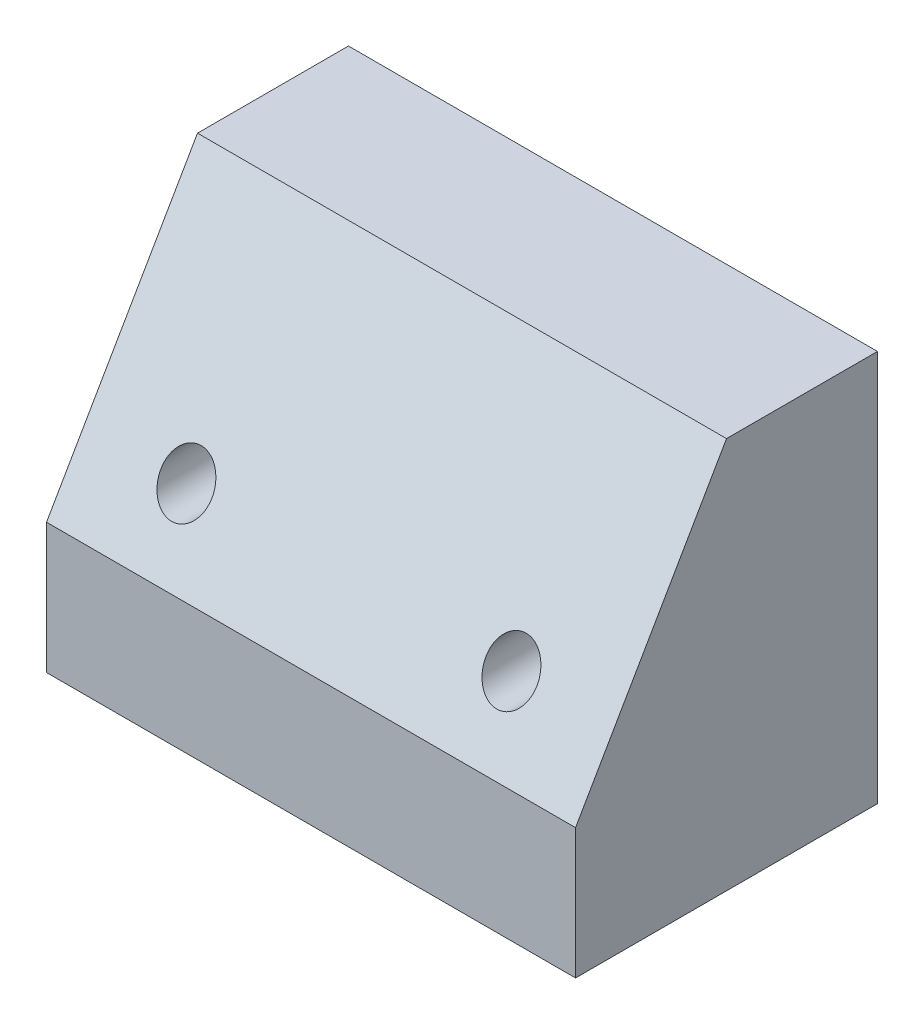
ISO-10303-21;
HEADER;
FILE_DESCRIPTION(('STEP AP214'),'2;1');
FILE_NAME('part.step','',(''),(''),'','','');
FILE_SCHEMA(('AUTOMOTIVE_DESIGN { 1 0 10303 214 1 1 1 1 }'));
ENDSEC;
DATA;
#1=APPLICATION_CONTEXT('core data for automotive mechanical design processes');
#2=APPLICATION_PROTOCOL_DEFINITION('international standard','automotive_design',2000,#1);
#3=PRODUCT_CONTEXT('',#1,'mechanical');
#4=PRODUCT('Part','Part','',(#3));
#5=PRODUCT_RELATED_PRODUCT_CATEGORY('part','',(#4));
#6=PRODUCT_DEFINITION_FORMATION('','',#4);
#7=PRODUCT_DEFINITION_CONTEXT('part definition',#1,'design');
#8=PRODUCT_DEFINITION('design','',#6,#7);
#9=PRODUCT_DEFINITION_SHAPE('','',#8);
#10=(LENGTH_UNIT() NAMED_UNIT(*) SI_UNIT(.MILLI.,.METRE.));
#11=(NAMED_UNIT(*) PLANE_ANGLE_UNIT() SI_UNIT($,.RADIAN.));
#12=(NAMED_UNIT(*) SI_UNIT($,.STERADIAN.) SOLID_ANGLE_UNIT());
#13=UNCERTAINTY_MEASURE_WITH_UNIT(LENGTH_MEASURE(1.E-05),#10,'distance_accuracy_value','');
#14=(GEOMETRIC_REPRESENTATION_CONTEXT(3) GLOBAL_UNCERTAINTY_ASSIGNED_CONTEXT((#13)) GLOBAL_UNIT_ASSIGNED_CONTEXT((#10,
#11,#12)) REPRESENTATION_CONTEXT('',''));
#15=CARTESIAN_POINT('',(0.,0.,0.));
#16=DIRECTION('',(0.,0.,1.));
#17=DIRECTION('',(1.,0.,0.));
#18=AXIS2_PLACEMENT_3D('',#15,#16,#17);
#19=CARTESIAN_POINT('',(-77.8,-57.6,88.8));
#20=DIRECTION('',(1.,0.,0.));
#21=DIRECTION('',(0.,0.,-1.));
#22=AXIS2_PLACEMENT_3D('',#19,#20,#21);
#23=PLANE('',#22);
#24=DIRECTION('',(0.,-1.,0.));
#25=VECTOR('',#24,1.);
#26=CARTESIAN_POINT('',(-77.8,-57.6,88.8));
#27=LINE('',#26,#25);
#28=CARTESIAN_POINT('',(-77.8,-19.3030558560579,88.8));
#29=VERTEX_POINT('',#28);
#30=CARTESIAN_POINT('',(-77.8,-57.6,88.8));
#31=VERTEX_POINT('',#30);
#32=EDGE_CURVE('E95',#29,#31,#27,.T.);
#33=ORIENTED_EDGE('',*,*,#32,.F.);
#34=DIRECTION('',(0.,-0.866025403784436,0.500000000000004));
#35=VECTOR('',#34,1.);
#36=CARTESIAN_POINT('',(-77.8,57.6,44.3999999999996));
#37=LINE('',#36,#35);
#38=CARTESIAN_POINT('',(-77.8,57.6,44.3999999999996));
#39=VERTEX_POINT('',#38);
#40=EDGE_CURVE('E48',#39,#29,#37,.T.);
#41=ORIENTED_EDGE('',*,*,#40,.F.);
#42=DIRECTION('',(0.,0.,-1.));
#43=VECTOR('',#42,1.);
#44=CARTESIAN_POINT('',(-77.8,57.6,88.8));
#45=LINE('',#44,#43);
#46=CARTESIAN_POINT('',(-77.8,57.6,0.));
#47=VERTEX_POINT('',#46);
#48=EDGE_CURVE('E76',#39,#47,#45,.T.);
#49=ORIENTED_EDGE('',*,*,#48,.T.);
#50=DIRECTION('',(0.,-1.,0.));
#51=VECTOR('',#50,1.);
#52=CARTESIAN_POINT('',(-77.8,-57.6,0.));
#53=LINE('',#52,#51);
#54=CARTESIAN_POINT('',(-77.8,-57.6,0.));
#55=VERTEX_POINT('',#54);
#56=EDGE_CURVE('E81',#47,#55,#53,.T.);
#57=ORIENTED_EDGE('',*,*,#56,.T.);
#58=DIRECTION('',(0.,0.,-1.));
#59=VECTOR('',#58,1.);
#60=CARTESIAN_POINT('',(-77.8,-57.6,88.8));
#61=LINE('',#60,#59);
#62=EDGE_CURVE('E11',#31,#55,#61,.T.);
#63=ORIENTED_EDGE('',*,*,#62,.F.);
#64=EDGE_LOOP('',(#33,#41,#49,#57,#63));
#65=FACE_BOUND('',#64,.T.);
#66=ADVANCED_FACE('F33',(#65),#23,.F.);
#67=CARTESIAN_POINT('',(77.8,-57.6,88.8));
#68=DIRECTION('',(0.,1.,0.));
#69=DIRECTION('',(-1.,0.,0.));
#70=AXIS2_PLACEMENT_3D('',#67,#68,#69);
#71=PLANE('',#70);
#72=DIRECTION('',(1.,0.,0.));
#73=VECTOR('',#72,1.);
#74=CARTESIAN_POINT('',(77.8,-57.6,0.));
#75=LINE('',#74,#73);
#76=CARTESIAN_POINT('',(77.8,-57.6,0.));
#77=VERTEX_POINT('',#76);
#78=EDGE_CURVE('E99',#55,#77,#75,.T.);
#79=ORIENTED_EDGE('',*,*,#78,.T.);
#80=DIRECTION('',(0.,0.,-1.));
#81=VECTOR('',#80,1.);
#82=CARTESIAN_POINT('',(77.8,-57.6,88.8));
#83=LINE('',#82,#81);
#84=CARTESIAN_POINT('',(77.8,-57.6,88.8));
#85=VERTEX_POINT('',#84);
#86=EDGE_CURVE('E41',#85,#77,#83,.T.);
#87=ORIENTED_EDGE('',*,*,#86,.F.);
#88=DIRECTION('',(1.,0.,0.));
#89=VECTOR('',#88,1.);
#90=CARTESIAN_POINT('',(77.8,-57.6,88.8));
#91=LINE('',#90,#89);
#92=EDGE_CURVE('E57',#31,#85,#91,.T.);
#93=ORIENTED_EDGE('',*,*,#92,.F.);
#94=ORIENTED_EDGE('',*,*,#62,.T.);
#95=EDGE_LOOP('',(#79,#87,#93,#94));
#96=FACE_BOUND('',#95,.T.);
#97=ADVANCED_FACE('F117',(#96),#71,.F.);
#98=CARTESIAN_POINT('',(77.8,-57.6,88.8));
#99=DIRECTION('',(-1.,0.,0.));
#100=DIRECTION('',(0.,0.,1.));
#101=AXIS2_PLACEMENT_3D('',#98,#99,#100);
#102=PLANE('',#101);
#103=DIRECTION('',(0.,0.,-1.));
#104=VECTOR('',#103,1.);
#105=CARTESIAN_POINT('',(77.8,57.6,88.8));
#106=LINE('',#105,#104);
#107=CARTESIAN_POINT('',(77.8,57.6,44.3999999999996));
#108=VERTEX_POINT('',#107);
#109=CARTESIAN_POINT('',(77.8,57.6,0.));
#110=VERTEX_POINT('',#109);
#111=EDGE_CURVE('E85',#108,#110,#106,.T.);
#112=ORIENTED_EDGE('',*,*,#111,.F.);
#113=DIRECTION('',(0.,-0.866025403784436,0.500000000000004));
#114=VECTOR('',#113,1.);
#115=CARTESIAN_POINT('',(77.8,57.6,44.3999999999996));
#116=LINE('',#115,#114);
#117=CARTESIAN_POINT('',(77.8,-19.3030558560579,88.8));
#118=VERTEX_POINT('',#117);
#119=EDGE_CURVE('E140',#108,#118,#116,.T.);
#120=ORIENTED_EDGE('',*,*,#119,.T.);
#121=DIRECTION('',(0.,1.,0.));
#122=VECTOR('',#121,1.);
#123=CARTESIAN_POINT('',(77.8,-57.6,88.8));
#124=LINE('',#123,#122);
#125=EDGE_CURVE('E86',#85,#118,#124,.T.);
#126=ORIENTED_EDGE('',*,*,#125,.F.);
#127=ORIENTED_EDGE('',*,*,#86,.T.);
#128=DIRECTION('',(0.,1.,0.));
#129=VECTOR('',#128,1.);
#130=CARTESIAN_POINT('',(77.8,-57.6,0.));
#131=LINE('',#130,#129);
#132=EDGE_CURVE('E96',#77,#110,#131,.T.);
#133=ORIENTED_EDGE('',*,*,#132,.T.);
#134=EDGE_LOOP('',(#112,#120,#126,#127,#133));
#135=FACE_BOUND('',#134,.T.);
#136=ADVANCED_FACE('F114',(#135),#102,.F.);
#137=CARTESIAN_POINT('',(77.8,57.6,88.8));
#138=DIRECTION('',(0.,-1.,0.));
#139=DIRECTION('',(0.,0.,-1.));
#140=AXIS2_PLACEMENT_3D('',#137,#138,#139);
#141=PLANE('',#140);
#142=ORIENTED_EDGE('',*,*,#48,.F.);
#143=DIRECTION('',(-1.,0.,0.));
#144=VECTOR('',#143,1.);
#145=CARTESIAN_POINT('',(77.8,57.6,44.3999999999996));
#146=LINE('',#145,#144);
#147=EDGE_CURVE('E137',#108,#39,#146,.T.);
#148=ORIENTED_EDGE('',*,*,#147,.F.);
#149=ORIENTED_EDGE('',*,*,#111,.T.);
#150=DIRECTION('',(-1.,0.,0.));
#151=VECTOR('',#150,1.);
#152=CARTESIAN_POINT('',(77.8,57.6,0.));
#153=LINE('',#152,#151);
#154=EDGE_CURVE('E89',#110,#47,#153,.T.);
#155=ORIENTED_EDGE('',*,*,#154,.T.);
#156=EDGE_LOOP('',(#142,#148,#149,#155));
#157=FACE_BOUND('',#156,.T.);
#158=ADVANCED_FACE('F90',(#157),#141,.F.);
#159=CARTESIAN_POINT('',(0.,0.,88.8));
#160=DIRECTION('',(0.,0.,1.));
#161=DIRECTION('',(1.,0.,0.));
#162=AXIS2_PLACEMENT_3D('',#159,#160,#161);
#163=PLANE('',#162);
#164=DIRECTION('',(-1.,0.,0.));
#165=VECTOR('',#164,1.);
#166=CARTESIAN_POINT('',(77.8,-19.3030558560579,88.8));
#167=LINE('',#166,#165);
#168=EDGE_CURVE('E139',#118,#29,#167,.T.);
#169=ORIENTED_EDGE('',*,*,#168,.T.);
#170=ORIENTED_EDGE('',*,*,#32,.T.);
#171=ORIENTED_EDGE('',*,*,#92,.T.);
#172=ORIENTED_EDGE('',*,*,#125,.T.);
#173=EDGE_LOOP('',(#169,#170,#171,#172));
#174=FACE_BOUND('',#173,.T.);
#175=ADVANCED_FACE('F146',(#174),#163,.T.);
#176=CARTESIAN_POINT('',(0.,0.,0.));
#177=DIRECTION('',(0.,0.,1.));
#178=DIRECTION('',(1.,0.,0.));
#179=AXIS2_PLACEMENT_3D('',#176,#177,#178);
#180=PLANE('',#179);
#181=CARTESIAN_POINT('',(47.8,0.,0.));
#182=DIRECTION('',(0.,0.,1.));
#183=DIRECTION('',(1.,0.,0.));
#184=AXIS2_PLACEMENT_3D('',#181,#182,#183);
#185=CIRCLE('',#184,4.49999999999998);
#186=CARTESIAN_POINT('',(52.3,0.,0.));
#187=VERTEX_POINT('',#186);
#188=EDGE_CURVE('E125',#187,#187,#185,.T.);
#189=ORIENTED_EDGE('',*,*,#188,.T.);
#190=EDGE_LOOP('',(#189));
#191=FACE_BOUND('',#190,.T.);
#192=CARTESIAN_POINT('',(-47.8,0.,0.));
#193=DIRECTION('',(0.,0.,1.));
#194=DIRECTION('',(1.,0.,0.));
#195=AXIS2_PLACEMENT_3D('',#192,#193,#194);
#196=CIRCLE('',#195,4.49999999999998);
#197=CARTESIAN_POINT('',(-43.3,0.,0.));
#198=VERTEX_POINT('',#197);
#199=EDGE_CURVE('E100',#198,#198,#196,.T.);
#200=ORIENTED_EDGE('',*,*,#199,.T.);
#201=EDGE_LOOP('',(#200));
#202=FACE_BOUND('',#201,.T.);
#203=ORIENTED_EDGE('',*,*,#56,.F.);
#204=ORIENTED_EDGE('',*,*,#154,.F.);
#205=ORIENTED_EDGE('',*,*,#132,.F.);
#206=ORIENTED_EDGE('',*,*,#78,.F.);
#207=EDGE_LOOP('',(#203,#204,#205,#206));
#208=FACE_BOUND('',#207,.T.);
#209=ADVANCED_FACE('F98',(#191,#202,#208),#180,.F.);
#210=CARTESIAN_POINT('',(-47.8,0.,88.8));
#211=DIRECTION('',(0.,0.,1.));
#212=DIRECTION('',(1.,0.,0.));
#213=AXIS2_PLACEMENT_3D('',#210,#211,#212);
#214=CYLINDRICAL_SURFACE('',#213,4.49999999999998);
#215=ORIENTED_EDGE('',*,*,#199,.F.);
#216=EDGE_LOOP('',(#215));
#217=FACE_BOUND('',#216,.T.);
#218=CARTESIAN_POINT('',(-47.8,0.,8.8));
#219=DIRECTION('',(0.,0.,1.));
#220=DIRECTION('',(1.,0.,0.));
#221=AXIS2_PLACEMENT_3D('',#218,#219,#220);
#222=CIRCLE('',#221,4.49999999999998);
#223=CARTESIAN_POINT('',(-43.3,0.,8.8));
#224=VERTEX_POINT('',#223);
#225=EDGE_CURVE('E104',#224,#224,#222,.T.);
#226=ORIENTED_EDGE('',*,*,#225,.T.);
#227=EDGE_LOOP('',(#226));
#228=FACE_BOUND('',#227,.T.);
#229=ADVANCED_FACE('F164',(#217,#228),#214,.F.);
#230=CARTESIAN_POINT('',(-43.3,0.,8.8));
#231=DIRECTION('',(0.,0.,-1.));
#232=DIRECTION('',(-1.,0.,0.));
#233=AXIS2_PLACEMENT_3D('',#230,#231,#232);
#234=PLANE('',#233);
#235=ORIENTED_EDGE('',*,*,#225,.F.);
#236=EDGE_LOOP('',(#235));
#237=FACE_BOUND('',#236,.T.);
#238=CARTESIAN_POINT('',(-47.8,0.,8.8));
#239=DIRECTION('',(0.,0.,1.));
#240=DIRECTION('',(1.,0.,0.));
#241=AXIS2_PLACEMENT_3D('',#238,#239,#240);
#242=CIRCLE('',#241,7.49999999999998);
#243=CARTESIAN_POINT('',(-40.3,0.,8.8));
#244=VERTEX_POINT('',#243);
#245=EDGE_CURVE('E122',#244,#244,#242,.T.);
#246=ORIENTED_EDGE('',*,*,#245,.T.);
#247=EDGE_LOOP('',(#246));
#248=FACE_BOUND('',#247,.T.);
#249=ADVANCED_FACE('F159',(#237,#248),#234,.F.);
#250=CARTESIAN_POINT('',(-47.8,0.,88.8));
#251=DIRECTION('',(0.,0.,1.));
#252=DIRECTION('',(1.,0.,0.));
#253=AXIS2_PLACEMENT_3D('',#250,#251,#252);
#254=CYLINDRICAL_SURFACE('',#253,7.49999999999999);
#255=CARTESIAN_POINT('',(-47.8,0.,77.6553755053224));
#256=DIRECTION('',(0.,-0.500000000000004,-0.866025403784436));
#257=DIRECTION('',(0.,-0.866025403784436,0.500000000000004));
#258=AXIS2_PLACEMENT_3D('',#255,#256,#257);
#259=ELLIPSE('',#258,8.66025403784439,7.49999999999999);
#260=CARTESIAN_POINT('',(-47.8,-7.49999999999999,81.9855025242447));
#261=VERTEX_POINT('',#260);
#262=EDGE_CURVE('E134',#261,#261,#259,.F.);
#263=ORIENTED_EDGE('',*,*,#262,.T.);
#264=EDGE_LOOP('',(#263));
#265=FACE_BOUND('',#264,.T.);
#266=ORIENTED_EDGE('',*,*,#245,.F.);
#267=EDGE_LOOP('',(#266));
#268=FACE_BOUND('',#267,.T.);
#269=ADVANCED_FACE('F155',(#265,#268),#254,.F.);
#270=CARTESIAN_POINT('',(47.8,0.,88.8));
#271=DIRECTION('',(0.,0.,1.));
#272=DIRECTION('',(1.,0.,0.));
#273=AXIS2_PLACEMENT_3D('',#270,#271,#272);
#274=CYLINDRICAL_SURFACE('',#273,4.49999999999998);
#275=ORIENTED_EDGE('',*,*,#188,.F.);
#276=EDGE_LOOP('',(#275));
#277=FACE_BOUND('',#276,.T.);
#278=CARTESIAN_POINT('',(47.8,0.,8.8));
#279=DIRECTION('',(0.,0.,1.));
#280=DIRECTION('',(1.,0.,0.));
#281=AXIS2_PLACEMENT_3D('',#278,#279,#280);
#282=CIRCLE('',#281,4.49999999999998);
#283=CARTESIAN_POINT('',(52.3,0.,8.8));
#284=VERTEX_POINT('',#283);
#285=EDGE_CURVE('E128',#284,#284,#282,.T.);
#286=ORIENTED_EDGE('',*,*,#285,.T.);
#287=EDGE_LOOP('',(#286));
#288=FACE_BOUND('',#287,.T.);
#289=ADVANCED_FACE('F158',(#277,#288),#274,.F.);
#290=CARTESIAN_POINT('',(52.3,0.,8.8));
#291=DIRECTION('',(0.,0.,-1.));
#292=DIRECTION('',(-1.,0.,0.));
#293=AXIS2_PLACEMENT_3D('',#290,#291,#292);
#294=PLANE('',#293);
#295=ORIENTED_EDGE('',*,*,#285,.F.);
#296=EDGE_LOOP('',(#295));
#297=FACE_BOUND('',#296,.T.);
#298=CARTESIAN_POINT('',(47.8,0.,8.8));
#299=DIRECTION('',(0.,0.,1.));
#300=DIRECTION('',(1.,0.,0.));
#301=AXIS2_PLACEMENT_3D('',#298,#299,#300);
#302=CIRCLE('',#301,7.49999999999998);
#303=CARTESIAN_POINT('',(55.3,0.,8.8));
#304=VERTEX_POINT('',#303);
#305=EDGE_CURVE('E131',#304,#304,#302,.T.);
#306=ORIENTED_EDGE('',*,*,#305,.T.);
#307=EDGE_LOOP('',(#306));
#308=FACE_BOUND('',#307,.T.);
#309=ADVANCED_FACE('F205',(#297,#308),#294,.F.);
#310=CARTESIAN_POINT('',(47.8,0.,88.8));
#311=DIRECTION('',(0.,0.,1.));
#312=DIRECTION('',(1.,0.,0.));
#313=AXIS2_PLACEMENT_3D('',#310,#311,#312);
#314=CYLINDRICAL_SURFACE('',#313,7.49999999999999);
#315=CARTESIAN_POINT('',(47.8,0.,77.6553755053224));
#316=DIRECTION('',(0.,-0.500000000000004,-0.866025403784436));
#317=DIRECTION('',(0.,-0.866025403784436,0.500000000000004));
#318=AXIS2_PLACEMENT_3D('',#315,#316,#317);
#319=ELLIPSE('',#318,8.66025403784439,7.49999999999999);
#320=CARTESIAN_POINT('',(47.8,-7.49999999999999,81.9855025242447));
#321=VERTEX_POINT('',#320);
#322=EDGE_CURVE('E36',#321,#321,#319,.F.);
#323=ORIENTED_EDGE('',*,*,#322,.T.);
#324=EDGE_LOOP('',(#323));
#325=FACE_BOUND('',#324,.T.);
#326=ORIENTED_EDGE('',*,*,#305,.F.);
#327=EDGE_LOOP('',(#326));
#328=FACE_BOUND('',#327,.T.);
#329=ADVANCED_FACE('F150',(#325,#328),#314,.F.);
#330=CARTESIAN_POINT('',(77.8,57.6,44.3999999999996));
#331=DIRECTION('',(0.,-0.500000000000004,-0.866025403784436));
#332=DIRECTION('',(0.,0.866025403784436,-0.500000000000004));
#333=AXIS2_PLACEMENT_3D('',#330,#331,#332);
#334=PLANE('',#333);
#335=ORIENTED_EDGE('',*,*,#322,.F.);
#336=EDGE_LOOP('',(#335));
#337=FACE_BOUND('',#336,.T.);
#338=ORIENTED_EDGE('',*,*,#40,.T.);
#339=ORIENTED_EDGE('',*,*,#168,.F.);
#340=ORIENTED_EDGE('',*,*,#119,.F.);
#341=ORIENTED_EDGE('',*,*,#147,.T.);
#342=EDGE_LOOP('',(#338,#339,#340,#341));
#343=FACE_BOUND('',#342,.T.);
#344=ORIENTED_EDGE('',*,*,#262,.F.);
#345=EDGE_LOOP('',(#344));
#346=FACE_BOUND('',#345,.T.);
#347=ADVANCED_FACE('F147',(#337,#343,#346),#334,.F.);
#348=CLOSED_SHELL('',(#66,#97,#136,#158,#175,#209,#229,#249,#269,#289,#309,#329,#347));
#349=MANIFOLD_SOLID_BREP('B2',#348);
#350=ADVANCED_BREP_SHAPE_REPRESENTATION('',(#18,#349),#14);
#351=SHAPE_DEFINITION_REPRESENTATION(#9,#350);
ENDSEC;
END-ISO-10303-21;
